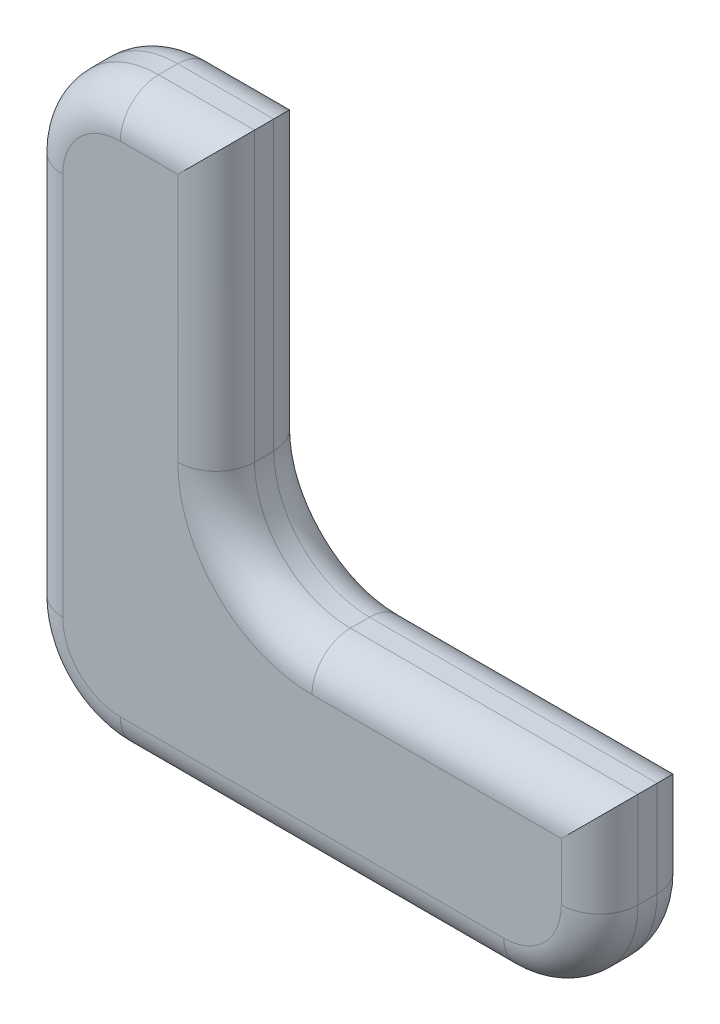
ISO-10303-21;
HEADER;
FILE_DESCRIPTION(('STEP AP214'),'2;1');
FILE_NAME('part.step','',(''),(''),'','','');
FILE_SCHEMA(('AUTOMOTIVE_DESIGN { 1 0 10303 214 1 1 1 1 }'));
ENDSEC;
DATA;
#1=APPLICATION_CONTEXT('core data for automotive mechanical design processes');
#2=APPLICATION_PROTOCOL_DEFINITION('international standard','automotive_design',2000,#1);
#3=PRODUCT_CONTEXT('',#1,'mechanical');
#4=PRODUCT('Part','Part','',(#3));
#5=PRODUCT_RELATED_PRODUCT_CATEGORY('part','',(#4));
#6=PRODUCT_DEFINITION_FORMATION('','',#4);
#7=PRODUCT_DEFINITION_CONTEXT('part definition',#1,'design');
#8=PRODUCT_DEFINITION('design','',#6,#7);
#9=PRODUCT_DEFINITION_SHAPE('','',#8);
#10=(LENGTH_UNIT() NAMED_UNIT(*) SI_UNIT(.MILLI.,.METRE.));
#11=(NAMED_UNIT(*) PLANE_ANGLE_UNIT() SI_UNIT($,.RADIAN.));
#12=(NAMED_UNIT(*) SI_UNIT($,.STERADIAN.) SOLID_ANGLE_UNIT());
#13=UNCERTAINTY_MEASURE_WITH_UNIT(LENGTH_MEASURE(1.E-05),#10,'distance_accuracy_value','');
#14=(GEOMETRIC_REPRESENTATION_CONTEXT(3) GLOBAL_UNCERTAINTY_ASSIGNED_CONTEXT((#13)) GLOBAL_UNIT_ASSIGNED_CONTEXT((#10,
#11,#12)) REPRESENTATION_CONTEXT('',''));
#15=CARTESIAN_POINT('',(0.,0.,0.));
#16=DIRECTION('',(0.,0.,1.));
#17=DIRECTION('',(1.,0.,0.));
#18=AXIS2_PLACEMENT_3D('',#15,#16,#17);
#19=CARTESIAN_POINT('',(10.,0.,5.));
#20=DIRECTION('',(-1.,0.,0.));
#21=DIRECTION('',(0.,-1.,0.));
#22=AXIS2_PLACEMENT_3D('',#19,#20,#21);
#23=PLANE('',#22);
#24=DIRECTION('',(0.,0.,-1.));
#25=VECTOR('',#24,1.);
#26=CARTESIAN_POINT('',(10.,20.,5.));
#27=LINE('',#26,#25);
#28=CARTESIAN_POINT('',(10.,20.,3.));
#29=VERTEX_POINT('',#28);
#30=CARTESIAN_POINT('',(10.,20.,2.));
#31=VERTEX_POINT('',#30);
#32=EDGE_CURVE('E408',#29,#31,#27,.T.);
#33=ORIENTED_EDGE('',*,*,#32,.F.);
#34=DIRECTION('',(0.,1.,0.));
#35=VECTOR('',#34,1.);
#36=CARTESIAN_POINT('',(10.,5.,3.));
#37=LINE('',#36,#35);
#38=CARTESIAN_POINT('',(10.,5.,3.));
#39=VERTEX_POINT('',#38);
#40=EDGE_CURVE('E240',#29,#39,#37,.F.);
#41=ORIENTED_EDGE('',*,*,#40,.T.);
#42=DIRECTION('',(0.,0.,1.));
#43=VECTOR('',#42,1.);
#44=CARTESIAN_POINT('',(10.,5.,0.));
#45=LINE('',#44,#43);
#46=CARTESIAN_POINT('',(10.,5.,2.));
#47=VERTEX_POINT('',#46);
#48=EDGE_CURVE('E201',#39,#47,#45,.F.);
#49=ORIENTED_EDGE('',*,*,#48,.T.);
#50=DIRECTION('',(0.,1.,0.));
#51=VECTOR('',#50,1.);
#52=CARTESIAN_POINT('',(10.,0.,2.));
#53=LINE('',#52,#51);
#54=EDGE_CURVE('E237',#47,#31,#53,.T.);
#55=ORIENTED_EDGE('',*,*,#54,.T.);
#56=EDGE_LOOP('',(#33,#41,#49,#55));
#57=FACE_BOUND('',#56,.T.);
#58=ADVANCED_FACE('F41',(#57),#23,.F.);
#59=CARTESIAN_POINT('',(0.,0.,5.));
#60=DIRECTION('',(1.,0.,0.));
#61=DIRECTION('',(0.,1.,0.));
#62=AXIS2_PLACEMENT_3D('',#59,#60,#61);
#63=PLANE('',#62);
#64=DIRECTION('',(0.,0.,-1.));
#65=VECTOR('',#64,1.);
#66=CARTESIAN_POINT('',(0.,-5.,5.));
#67=LINE('',#66,#65);
#68=CARTESIAN_POINT('',(0.,-5.,2.));
#69=VERTEX_POINT('',#68);
#70=CARTESIAN_POINT('',(0.,-5.,3.));
#71=VERTEX_POINT('',#70);
#72=EDGE_CURVE('E424',#69,#71,#67,.F.);
#73=ORIENTED_EDGE('',*,*,#72,.T.);
#74=DIRECTION('',(0.,-1.,0.));
#75=VECTOR('',#74,1.);
#76=CARTESIAN_POINT('',(0.,15.,3.));
#77=LINE('',#76,#75);
#78=CARTESIAN_POINT('',(0.,15.,3.));
#79=VERTEX_POINT('',#78);
#80=EDGE_CURVE('E222',#71,#79,#77,.F.);
#81=ORIENTED_EDGE('',*,*,#80,.T.);
#82=DIRECTION('',(0.,0.,1.));
#83=VECTOR('',#82,1.);
#84=CARTESIAN_POINT('',(0.,15.,0.));
#85=LINE('',#84,#83);
#86=CARTESIAN_POINT('',(0.,15.,2.));
#87=VERTEX_POINT('',#86);
#88=EDGE_CURVE('E428',#79,#87,#85,.F.);
#89=ORIENTED_EDGE('',*,*,#88,.T.);
#90=DIRECTION('',(0.,-1.,0.));
#91=VECTOR('',#90,1.);
#92=CARTESIAN_POINT('',(0.,0.,2.));
#93=LINE('',#92,#91);
#94=EDGE_CURVE('E219',#87,#69,#93,.T.);
#95=ORIENTED_EDGE('',*,*,#94,.T.);
#96=EDGE_LOOP('',(#73,#81,#89,#95));
#97=FACE_BOUND('',#96,.T.);
#98=ADVANCED_FACE('F472',(#97),#63,.F.);
#99=CARTESIAN_POINT('',(0.,-10.,5.));
#100=DIRECTION('',(0.,1.,0.));
#101=DIRECTION('',(0.,0.,1.));
#102=AXIS2_PLACEMENT_3D('',#99,#100,#101);
#103=PLANE('',#102);
#104=DIRECTION('',(0.,0.,-1.));
#105=VECTOR('',#104,1.);
#106=CARTESIAN_POINT('',(25.,-10.,5.));
#107=LINE('',#106,#105);
#108=CARTESIAN_POINT('',(25.,-10.,2.));
#109=VERTEX_POINT('',#108);
#110=CARTESIAN_POINT('',(25.,-10.,3.));
#111=VERTEX_POINT('',#110);
#112=EDGE_CURVE('E400',#109,#111,#107,.F.);
#113=ORIENTED_EDGE('',*,*,#112,.T.);
#114=DIRECTION('',(1.,0.,0.));
#115=VECTOR('',#114,1.);
#116=CARTESIAN_POINT('',(5.,-10.,3.));
#117=LINE('',#116,#115);
#118=CARTESIAN_POINT('',(5.,-10.,3.));
#119=VERTEX_POINT('',#118);
#120=EDGE_CURVE('E271',#111,#119,#117,.F.);
#121=ORIENTED_EDGE('',*,*,#120,.T.);
#122=DIRECTION('',(0.,0.,-1.));
#123=VECTOR('',#122,1.);
#124=CARTESIAN_POINT('',(5.,-10.,5.));
#125=LINE('',#124,#123);
#126=CARTESIAN_POINT('',(5.,-10.,2.));
#127=VERTEX_POINT('',#126);
#128=EDGE_CURVE('E407',#119,#127,#125,.T.);
#129=ORIENTED_EDGE('',*,*,#128,.T.);
#130=DIRECTION('',(1.,0.,0.));
#131=VECTOR('',#130,1.);
#132=CARTESIAN_POINT('',(0.,-10.,2.));
#133=LINE('',#132,#131);
#134=EDGE_CURVE('E268',#127,#109,#133,.T.);
#135=ORIENTED_EDGE('',*,*,#134,.T.);
#136=EDGE_LOOP('',(#113,#121,#129,#135));
#137=FACE_BOUND('',#136,.T.);
#138=ADVANCED_FACE('F510',(#137),#103,.F.);
#139=CARTESIAN_POINT('',(0.,0.,5.));
#140=DIRECTION('',(0.,0.,1.));
#141=DIRECTION('',(1.,0.,0.));
#142=AXIS2_PLACEMENT_3D('',#139,#140,#141);
#143=PLANE('',#142);
#144=DIRECTION('',(0.,-1.,0.));
#145=VECTOR('',#144,1.);
#146=CARTESIAN_POINT('',(2.,-5.,5.));
#147=LINE('',#146,#145);
#148=CARTESIAN_POINT('',(2.,15.,5.));
#149=VERTEX_POINT('',#148);
#150=CARTESIAN_POINT('',(2.,-5.,5.));
#151=VERTEX_POINT('',#150);
#152=EDGE_CURVE('E205',#149,#151,#147,.T.);
#153=ORIENTED_EDGE('',*,*,#152,.T.);
#154=CARTESIAN_POINT('',(5.,-5.,5.));
#155=DIRECTION('',(0.,0.,1.));
#156=DIRECTION('',(1.,0.,0.));
#157=AXIS2_PLACEMENT_3D('',#154,#155,#156);
#158=CIRCLE('',#157,3.);
#159=CARTESIAN_POINT('',(5.,-8.,5.));
#160=VERTEX_POINT('',#159);
#161=EDGE_CURVE('E184',#151,#160,#158,.T.);
#162=ORIENTED_EDGE('',*,*,#161,.T.);
#163=DIRECTION('',(1.,0.,0.));
#164=VECTOR('',#163,1.);
#165=CARTESIAN_POINT('',(25.,-8.,5.));
#166=LINE('',#165,#164);
#167=CARTESIAN_POINT('',(25.,-8.,5.));
#168=VERTEX_POINT('',#167);
#169=EDGE_CURVE('E193',#160,#168,#166,.T.);
#170=ORIENTED_EDGE('',*,*,#169,.T.);
#171=CARTESIAN_POINT('',(25.,-5.,5.));
#172=DIRECTION('',(0.,0.,1.));
#173=DIRECTION('',(1.,0.,0.));
#174=AXIS2_PLACEMENT_3D('',#171,#172,#173);
#175=CIRCLE('',#174,3.);
#176=CARTESIAN_POINT('',(28.,-5.,5.));
#177=VERTEX_POINT('',#176);
#178=EDGE_CURVE('E200',#168,#177,#175,.T.);
#179=ORIENTED_EDGE('',*,*,#178,.T.);
#180=DIRECTION('',(0.,-1.,0.));
#181=VECTOR('',#180,1.);
#182=CARTESIAN_POINT('',(28.,0.,5.));
#183=LINE('',#182,#181);
#184=CARTESIAN_POINT('',(28.,-2.,5.));
#185=VERTEX_POINT('',#184);
#186=EDGE_CURVE('E441',#177,#185,#183,.F.);
#187=ORIENTED_EDGE('',*,*,#186,.T.);
#188=DIRECTION('',(-1.,0.,0.));
#189=VECTOR('',#188,1.);
#190=CARTESIAN_POINT('',(15.,-2.,5.));
#191=LINE('',#190,#189);
#192=CARTESIAN_POINT('',(15.,-2.,5.));
#193=VERTEX_POINT('',#192);
#194=EDGE_CURVE('E444',#185,#193,#191,.T.);
#195=ORIENTED_EDGE('',*,*,#194,.T.);
#196=CARTESIAN_POINT('',(15.,5.,5.));
#197=DIRECTION('',(0.,0.,1.));
#198=DIRECTION('',(1.,0.,0.));
#199=AXIS2_PLACEMENT_3D('',#196,#197,#198);
#200=CIRCLE('',#199,7.);
#201=CARTESIAN_POINT('',(8.,5.,5.));
#202=VERTEX_POINT('',#201);
#203=EDGE_CURVE('E447',#193,#202,#200,.F.);
#204=ORIENTED_EDGE('',*,*,#203,.T.);
#205=DIRECTION('',(0.,1.,0.));
#206=VECTOR('',#205,1.);
#207=CARTESIAN_POINT('',(8.,20.,5.));
#208=LINE('',#207,#206);
#209=CARTESIAN_POINT('',(8.,18.,5.));
#210=VERTEX_POINT('',#209);
#211=EDGE_CURVE('E450',#202,#210,#208,.T.);
#212=ORIENTED_EDGE('',*,*,#211,.T.);
#213=DIRECTION('',(1.,0.,0.));
#214=VECTOR('',#213,1.);
#215=CARTESIAN_POINT('',(0.,18.,5.));
#216=LINE('',#215,#214);
#217=CARTESIAN_POINT('',(5.,18.,5.));
#218=VERTEX_POINT('',#217);
#219=EDGE_CURVE('E453',#210,#218,#216,.F.);
#220=ORIENTED_EDGE('',*,*,#219,.T.);
#221=CARTESIAN_POINT('',(5.,15.,5.));
#222=DIRECTION('',(0.,0.,1.));
#223=DIRECTION('',(1.,0.,0.));
#224=AXIS2_PLACEMENT_3D('',#221,#222,#223);
#225=CIRCLE('',#224,3.);
#226=EDGE_CURVE('E213',#218,#149,#225,.T.);
#227=ORIENTED_EDGE('',*,*,#226,.T.);
#228=EDGE_LOOP('',(#153,#162,#170,#179,#187,#195,#204,#212,#220,#227));
#229=FACE_BOUND('',#228,.T.);
#230=ADVANCED_FACE('F203',(#229),#143,.T.);
#231=CARTESIAN_POINT('',(0.,0.,0.));
#232=DIRECTION('',(0.,0.,1.));
#233=DIRECTION('',(1.,0.,0.));
#234=AXIS2_PLACEMENT_3D('',#231,#232,#233);
#235=PLANE('',#234);
#236=CARTESIAN_POINT('',(15.,5.,0.));
#237=DIRECTION('',(0.,0.,1.));
#238=DIRECTION('',(1.,0.,0.));
#239=AXIS2_PLACEMENT_3D('',#236,#237,#238);
#240=CIRCLE('',#239,7.);
#241=CARTESIAN_POINT('',(8.,5.,0.));
#242=VERTEX_POINT('',#241);
#243=CARTESIAN_POINT('',(15.,-2.,0.));
#244=VERTEX_POINT('',#243);
#245=EDGE_CURVE('E51',#242,#244,#240,.T.);
#246=ORIENTED_EDGE('',*,*,#245,.T.);
#247=DIRECTION('',(-1.,0.,0.));
#248=VECTOR('',#247,1.);
#249=CARTESIAN_POINT('',(0.,-2.,0.));
#250=LINE('',#249,#248);
#251=CARTESIAN_POINT('',(28.,-2.,0.));
#252=VERTEX_POINT('',#251);
#253=EDGE_CURVE('E11',#244,#252,#250,.F.);
#254=ORIENTED_EDGE('',*,*,#253,.T.);
#255=DIRECTION('',(0.,1.,0.));
#256=VECTOR('',#255,1.);
#257=CARTESIAN_POINT('',(28.,0.,0.));
#258=LINE('',#257,#256);
#259=CARTESIAN_POINT('',(28.,-5.,0.));
#260=VERTEX_POINT('',#259);
#261=EDGE_CURVE('E274',#252,#260,#258,.F.);
#262=ORIENTED_EDGE('',*,*,#261,.T.);
#263=CARTESIAN_POINT('',(25.,-5.,0.));
#264=DIRECTION('',(0.,0.,1.));
#265=DIRECTION('',(1.,0.,0.));
#266=AXIS2_PLACEMENT_3D('',#263,#264,#265);
#267=CIRCLE('',#266,3.);
#268=CARTESIAN_POINT('',(25.,-8.,0.));
#269=VERTEX_POINT('',#268);
#270=EDGE_CURVE('E277',#260,#269,#267,.F.);
#271=ORIENTED_EDGE('',*,*,#270,.T.);
#272=DIRECTION('',(1.,0.,0.));
#273=VECTOR('',#272,1.);
#274=CARTESIAN_POINT('',(0.,-8.,0.));
#275=LINE('',#274,#273);
#276=CARTESIAN_POINT('',(5.,-8.,0.));
#277=VERTEX_POINT('',#276);
#278=EDGE_CURVE('E280',#269,#277,#275,.F.);
#279=ORIENTED_EDGE('',*,*,#278,.T.);
#280=CARTESIAN_POINT('',(5.,-5.,0.));
#281=DIRECTION('',(0.,0.,1.));
#282=DIRECTION('',(1.,0.,0.));
#283=AXIS2_PLACEMENT_3D('',#280,#281,#282);
#284=CIRCLE('',#283,3.);
#285=CARTESIAN_POINT('',(2.,-5.,0.));
#286=VERTEX_POINT('',#285);
#287=EDGE_CURVE('E283',#277,#286,#284,.F.);
#288=ORIENTED_EDGE('',*,*,#287,.T.);
#289=DIRECTION('',(0.,-1.,0.));
#290=VECTOR('',#289,1.);
#291=CARTESIAN_POINT('',(2.,0.,0.));
#292=LINE('',#291,#290);
#293=CARTESIAN_POINT('',(2.,15.,0.));
#294=VERTEX_POINT('',#293);
#295=EDGE_CURVE('E286',#286,#294,#292,.F.);
#296=ORIENTED_EDGE('',*,*,#295,.T.);
#297=CARTESIAN_POINT('',(5.,15.,0.));
#298=DIRECTION('',(0.,0.,1.));
#299=DIRECTION('',(1.,0.,0.));
#300=AXIS2_PLACEMENT_3D('',#297,#298,#299);
#301=CIRCLE('',#300,3.);
#302=CARTESIAN_POINT('',(5.,18.,0.));
#303=VERTEX_POINT('',#302);
#304=EDGE_CURVE('E289',#294,#303,#301,.F.);
#305=ORIENTED_EDGE('',*,*,#304,.T.);
#306=DIRECTION('',(-1.,0.,0.));
#307=VECTOR('',#306,1.);
#308=CARTESIAN_POINT('',(10.,18.,0.));
#309=LINE('',#308,#307);
#310=CARTESIAN_POINT('',(8.,18.,0.));
#311=VERTEX_POINT('',#310);
#312=EDGE_CURVE('E292',#303,#311,#309,.F.);
#313=ORIENTED_EDGE('',*,*,#312,.T.);
#314=DIRECTION('',(0.,1.,0.));
#315=VECTOR('',#314,1.);
#316=CARTESIAN_POINT('',(8.,0.,0.));
#317=LINE('',#316,#315);
#318=EDGE_CURVE('E62',#311,#242,#317,.F.);
#319=ORIENTED_EDGE('',*,*,#318,.T.);
#320=EDGE_LOOP('',(#246,#254,#262,#271,#279,#288,#296,#305,#313,#319));
#321=FACE_BOUND('',#320,.T.);
#322=ADVANCED_FACE('F379',(#321),#235,.F.);
#323=CARTESIAN_POINT('',(0.,20.,0.));
#324=DIRECTION('',(0.,1.,0.));
#325=DIRECTION('',(0.,0.,1.));
#326=AXIS2_PLACEMENT_3D('',#323,#324,#325);
#327=PLANE('',#326);
#328=DIRECTION('',(0.,0.,1.));
#329=VECTOR('',#328,1.);
#330=CARTESIAN_POINT('',(5.,20.,5.));
#331=LINE('',#330,#329);
#332=CARTESIAN_POINT('',(5.,20.,2.));
#333=VERTEX_POINT('',#332);
#334=CARTESIAN_POINT('',(5.,20.,3.));
#335=VERTEX_POINT('',#334);
#336=EDGE_CURVE('E420',#333,#335,#331,.T.);
#337=ORIENTED_EDGE('',*,*,#336,.T.);
#338=DIRECTION('',(1.,0.,0.));
#339=VECTOR('',#338,1.);
#340=CARTESIAN_POINT('',(0.,20.,3.));
#341=LINE('',#340,#339);
#342=EDGE_CURVE('E234',#335,#29,#341,.T.);
#343=ORIENTED_EDGE('',*,*,#342,.T.);
#344=ORIENTED_EDGE('',*,*,#32,.T.);
#345=DIRECTION('',(-1.,0.,0.));
#346=VECTOR('',#345,1.);
#347=CARTESIAN_POINT('',(5.,20.,2.));
#348=LINE('',#347,#346);
#349=EDGE_CURVE('E231',#31,#333,#348,.T.);
#350=ORIENTED_EDGE('',*,*,#349,.T.);
#351=EDGE_LOOP('',(#337,#343,#344,#350));
#352=FACE_BOUND('',#351,.T.);
#353=ADVANCED_FACE('F734',(#352),#327,.T.);
#354=CARTESIAN_POINT('',(30.,0.,5.));
#355=DIRECTION('',(0.,-1.,0.));
#356=DIRECTION('',(1.,0.,0.));
#357=AXIS2_PLACEMENT_3D('',#354,#355,#356);
#358=PLANE('',#357);
#359=DIRECTION('',(0.,0.,1.));
#360=VECTOR('',#359,1.);
#361=CARTESIAN_POINT('',(15.,0.,5.));
#362=LINE('',#361,#360);
#363=CARTESIAN_POINT('',(15.,0.,2.));
#364=VERTEX_POINT('',#363);
#365=CARTESIAN_POINT('',(15.,0.,3.));
#366=VERTEX_POINT('',#365);
#367=EDGE_CURVE('E432',#364,#366,#362,.T.);
#368=ORIENTED_EDGE('',*,*,#367,.T.);
#369=DIRECTION('',(-1.,0.,0.));
#370=VECTOR('',#369,1.);
#371=CARTESIAN_POINT('',(30.,0.,3.));
#372=LINE('',#371,#370);
#373=CARTESIAN_POINT('',(30.,0.,3.));
#374=VERTEX_POINT('',#373);
#375=EDGE_CURVE('E253',#366,#374,#372,.F.);
#376=ORIENTED_EDGE('',*,*,#375,.T.);
#377=DIRECTION('',(0.,0.,1.));
#378=VECTOR('',#377,1.);
#379=CARTESIAN_POINT('',(30.,0.,5.));
#380=LINE('',#379,#378);
#381=CARTESIAN_POINT('',(30.,0.,2.));
#382=VERTEX_POINT('',#381);
#383=EDGE_CURVE('E331',#382,#374,#380,.T.);
#384=ORIENTED_EDGE('',*,*,#383,.F.);
#385=DIRECTION('',(-1.,0.,0.));
#386=VECTOR('',#385,1.);
#387=CARTESIAN_POINT('',(30.,0.,2.));
#388=LINE('',#387,#386);
#389=EDGE_CURVE('E249',#382,#364,#388,.T.);
#390=ORIENTED_EDGE('',*,*,#389,.T.);
#391=EDGE_LOOP('',(#368,#376,#384,#390));
#392=FACE_BOUND('',#391,.T.);
#393=ADVANCED_FACE('F725',(#392),#358,.F.);
#394=CARTESIAN_POINT('',(30.,0.,0.));
#395=DIRECTION('',(-1.,0.,0.));
#396=DIRECTION('',(0.,-1.,0.));
#397=AXIS2_PLACEMENT_3D('',#394,#395,#396);
#398=PLANE('',#397);
#399=ORIENTED_EDGE('',*,*,#383,.T.);
#400=DIRECTION('',(0.,-1.,0.));
#401=VECTOR('',#400,1.);
#402=CARTESIAN_POINT('',(30.,-5.,3.));
#403=LINE('',#402,#401);
#404=CARTESIAN_POINT('',(30.,-5.,3.));
#405=VERTEX_POINT('',#404);
#406=EDGE_CURVE('E259',#374,#405,#403,.T.);
#407=ORIENTED_EDGE('',*,*,#406,.T.);
#408=DIRECTION('',(0.,0.,-1.));
#409=VECTOR('',#408,1.);
#410=CARTESIAN_POINT('',(30.,-5.,0.));
#411=LINE('',#410,#409);
#412=CARTESIAN_POINT('',(30.,-5.,2.));
#413=VERTEX_POINT('',#412);
#414=EDGE_CURVE('E397',#405,#413,#411,.T.);
#415=ORIENTED_EDGE('',*,*,#414,.T.);
#416=DIRECTION('',(0.,1.,0.));
#417=VECTOR('',#416,1.);
#418=CARTESIAN_POINT('',(30.,0.,2.));
#419=LINE('',#418,#417);
#420=EDGE_CURVE('E256',#413,#382,#419,.T.);
#421=ORIENTED_EDGE('',*,*,#420,.T.);
#422=EDGE_LOOP('',(#399,#407,#415,#421));
#423=FACE_BOUND('',#422,.T.);
#424=ADVANCED_FACE('F403',(#423),#398,.F.);
#425=CARTESIAN_POINT('',(25.,-5.,0.));
#426=DIRECTION('',(0.,0.,-1.));
#427=DIRECTION('',(-1.,0.,0.));
#428=AXIS2_PLACEMENT_3D('',#425,#426,#427);
#429=CYLINDRICAL_SURFACE('',#428,5.);
#430=ORIENTED_EDGE('',*,*,#414,.F.);
#431=CARTESIAN_POINT('',(25.,-5.,3.));
#432=DIRECTION('',(0.,0.,1.));
#433=DIRECTION('',(1.,0.,0.));
#434=AXIS2_PLACEMENT_3D('',#431,#432,#433);
#435=CIRCLE('',#434,5.);
#436=EDGE_CURVE('E265',#405,#111,#435,.F.);
#437=ORIENTED_EDGE('',*,*,#436,.T.);
#438=ORIENTED_EDGE('',*,*,#112,.F.);
#439=CARTESIAN_POINT('',(25.,-5.,2.));
#440=DIRECTION('',(0.,0.,1.));
#441=DIRECTION('',(1.,0.,0.));
#442=AXIS2_PLACEMENT_3D('',#439,#440,#441);
#443=CIRCLE('',#442,5.);
#444=EDGE_CURVE('E262',#109,#413,#443,.T.);
#445=ORIENTED_EDGE('',*,*,#444,.T.);
#446=EDGE_LOOP('',(#430,#437,#438,#445));
#447=FACE_BOUND('',#446,.T.);
#448=ADVANCED_FACE('F396',(#447),#429,.T.);
#449=CARTESIAN_POINT('',(5.,15.,0.));
#450=DIRECTION('',(0.,0.,-1.));
#451=DIRECTION('',(-1.,0.,0.));
#452=AXIS2_PLACEMENT_3D('',#449,#450,#451);
#453=CYLINDRICAL_SURFACE('',#452,5.);
#454=ORIENTED_EDGE('',*,*,#88,.F.);
#455=CARTESIAN_POINT('',(5.,15.,3.));
#456=DIRECTION('',(0.,0.,1.));
#457=DIRECTION('',(1.,0.,0.));
#458=AXIS2_PLACEMENT_3D('',#455,#456,#457);
#459=CIRCLE('',#458,5.);
#460=EDGE_CURVE('E228',#79,#335,#459,.F.);
#461=ORIENTED_EDGE('',*,*,#460,.T.);
#462=ORIENTED_EDGE('',*,*,#336,.F.);
#463=CARTESIAN_POINT('',(5.,15.,2.));
#464=DIRECTION('',(0.,0.,1.));
#465=DIRECTION('',(1.,0.,0.));
#466=AXIS2_PLACEMENT_3D('',#463,#464,#465);
#467=CIRCLE('',#466,5.);
#468=EDGE_CURVE('E225',#333,#87,#467,.T.);
#469=ORIENTED_EDGE('',*,*,#468,.T.);
#470=EDGE_LOOP('',(#454,#461,#462,#469));
#471=FACE_BOUND('',#470,.T.);
#472=ADVANCED_FACE('F474',(#471),#453,.T.);
#473=CARTESIAN_POINT('',(15.,5.,5.));
#474=DIRECTION('',(0.,0.,-1.));
#475=DIRECTION('',(-1.,0.,0.));
#476=AXIS2_PLACEMENT_3D('',#473,#474,#475);
#477=CYLINDRICAL_SURFACE('',#476,5.);
#478=ORIENTED_EDGE('',*,*,#48,.F.);
#479=CARTESIAN_POINT('',(15.,5.,3.));
#480=DIRECTION('',(0.,0.,1.));
#481=DIRECTION('',(1.,0.,0.));
#482=AXIS2_PLACEMENT_3D('',#479,#480,#481);
#483=CIRCLE('',#482,5.);
#484=EDGE_CURVE('E246',#39,#366,#483,.T.);
#485=ORIENTED_EDGE('',*,*,#484,.T.);
#486=ORIENTED_EDGE('',*,*,#367,.F.);
#487=CARTESIAN_POINT('',(15.,5.,2.));
#488=DIRECTION('',(0.,0.,1.));
#489=DIRECTION('',(1.,0.,0.));
#490=AXIS2_PLACEMENT_3D('',#487,#488,#489);
#491=CIRCLE('',#490,5.);
#492=EDGE_CURVE('E243',#364,#47,#491,.F.);
#493=ORIENTED_EDGE('',*,*,#492,.T.);
#494=EDGE_LOOP('',(#478,#485,#486,#493));
#495=FACE_BOUND('',#494,.T.);
#496=ADVANCED_FACE('F523',(#495),#477,.F.);
#497=CARTESIAN_POINT('',(5.,-5.,5.));
#498=DIRECTION('',(0.,0.,-1.));
#499=DIRECTION('',(-1.,0.,0.));
#500=AXIS2_PLACEMENT_3D('',#497,#498,#499);
#501=CYLINDRICAL_SURFACE('',#500,5.);
#502=ORIENTED_EDGE('',*,*,#128,.F.);
#503=CARTESIAN_POINT('',(5.,-5.,3.));
#504=DIRECTION('',(0.,0.,1.));
#505=DIRECTION('',(1.,0.,0.));
#506=AXIS2_PLACEMENT_3D('',#503,#504,#505);
#507=CIRCLE('',#506,5.);
#508=EDGE_CURVE('E186',#119,#71,#507,.F.);
#509=ORIENTED_EDGE('',*,*,#508,.T.);
#510=ORIENTED_EDGE('',*,*,#72,.F.);
#511=CARTESIAN_POINT('',(5.,-5.,2.));
#512=DIRECTION('',(0.,0.,1.));
#513=DIRECTION('',(1.,0.,0.));
#514=AXIS2_PLACEMENT_3D('',#511,#512,#513);
#515=CIRCLE('',#514,5.);
#516=EDGE_CURVE('E208',#69,#127,#515,.T.);
#517=ORIENTED_EDGE('',*,*,#516,.T.);
#518=EDGE_LOOP('',(#502,#509,#510,#517));
#519=FACE_BOUND('',#518,.T.);
#520=ADVANCED_FACE('F471',(#519),#501,.T.);
#521=CARTESIAN_POINT('',(15.,5.,3.));
#522=DIRECTION('',(0.,0.,1.));
#523=DIRECTION('',(1.,0.,0.));
#524=AXIS2_PLACEMENT_3D('',#521,#522,#523);
#525=TOROIDAL_SURFACE('',#524,7.,2.);
#526=CARTESIAN_POINT('',(15.,-2.,3.));
#527=DIRECTION('',(1.,0.,0.));
#528=DIRECTION('',(0.,0.,-1.));
#529=AXIS2_PLACEMENT_3D('',#526,#527,#528);
#530=CIRCLE('',#529,2.);
#531=EDGE_CURVE('E323',#366,#193,#530,.T.);
#532=ORIENTED_EDGE('',*,*,#531,.F.);
#533=ORIENTED_EDGE('',*,*,#484,.F.);
#534=CARTESIAN_POINT('',(8.,5.,3.));
#535=DIRECTION('',(0.,1.,0.));
#536=DIRECTION('',(0.,0.,1.));
#537=AXIS2_PLACEMENT_3D('',#534,#535,#536);
#538=CIRCLE('',#537,2.);
#539=EDGE_CURVE('E327',#202,#39,#538,.T.);
#540=ORIENTED_EDGE('',*,*,#539,.F.);
#541=ORIENTED_EDGE('',*,*,#203,.F.);
#542=EDGE_LOOP('',(#532,#533,#540,#541));
#543=FACE_BOUND('',#542,.T.);
#544=ADVANCED_FACE('F529',(#543),#525,.T.);
#545=CARTESIAN_POINT('',(8.,0.,3.));
#546=DIRECTION('',(0.,-1.,0.));
#547=DIRECTION('',(1.,0.,0.));
#548=AXIS2_PLACEMENT_3D('',#545,#546,#547);
#549=CYLINDRICAL_SURFACE('',#548,2.);
#550=ORIENTED_EDGE('',*,*,#539,.T.);
#551=ORIENTED_EDGE('',*,*,#40,.F.);
#552=CARTESIAN_POINT('',(8.,18.,3.));
#553=DIRECTION('',(0.707106781186548,-0.707106781186547,0.));
#554=DIRECTION('',(-0.707106781186547,-0.707106781186548,0.));
#555=AXIS2_PLACEMENT_3D('',#552,#553,#554);
#556=ELLIPSE('',#555,2.82842712474619,2.);
#557=EDGE_CURVE('E319',#210,#29,#556,.F.);
#558=ORIENTED_EDGE('',*,*,#557,.F.);
#559=ORIENTED_EDGE('',*,*,#211,.F.);
#560=EDGE_LOOP('',(#550,#551,#558,#559));
#561=FACE_BOUND('',#560,.T.);
#562=ADVANCED_FACE('F553',(#561),#549,.T.);
#563=CARTESIAN_POINT('',(0.,-2.,3.));
#564=DIRECTION('',(1.,0.,0.));
#565=DIRECTION('',(0.,1.,0.));
#566=AXIS2_PLACEMENT_3D('',#563,#564,#565);
#567=CYLINDRICAL_SURFACE('',#566,2.);
#568=ORIENTED_EDGE('',*,*,#531,.T.);
#569=ORIENTED_EDGE('',*,*,#194,.F.);
#570=CARTESIAN_POINT('',(28.,-2.,3.));
#571=DIRECTION('',(-0.707106781186548,0.707106781186547,0.));
#572=DIRECTION('',(0.707106781186547,0.707106781186548,0.));
#573=AXIS2_PLACEMENT_3D('',#570,#571,#572);
#574=ELLIPSE('',#573,2.82842712474619,2.);
#575=EDGE_CURVE('E315',#374,#185,#574,.F.);
#576=ORIENTED_EDGE('',*,*,#575,.F.);
#577=ORIENTED_EDGE('',*,*,#375,.F.);
#578=EDGE_LOOP('',(#568,#569,#576,#577));
#579=FACE_BOUND('',#578,.T.);
#580=ADVANCED_FACE('F549',(#579),#567,.T.);
#581=CARTESIAN_POINT('',(0.,18.,3.));
#582=DIRECTION('',(1.,0.,0.));
#583=DIRECTION('',(0.,0.,-1.));
#584=AXIS2_PLACEMENT_3D('',#581,#582,#583);
#585=CYLINDRICAL_SURFACE('',#584,2.);
#586=ORIENTED_EDGE('',*,*,#557,.T.);
#587=ORIENTED_EDGE('',*,*,#342,.F.);
#588=CARTESIAN_POINT('',(5.,18.,3.));
#589=DIRECTION('',(-1.,0.,0.));
#590=DIRECTION('',(0.,0.,1.));
#591=AXIS2_PLACEMENT_3D('',#588,#589,#590);
#592=CIRCLE('',#591,2.);
#593=EDGE_CURVE('E311',#218,#335,#592,.T.);
#594=ORIENTED_EDGE('',*,*,#593,.F.);
#595=ORIENTED_EDGE('',*,*,#219,.F.);
#596=EDGE_LOOP('',(#586,#587,#594,#595));
#597=FACE_BOUND('',#596,.T.);
#598=ADVANCED_FACE('F545',(#597),#585,.T.);
#599=CARTESIAN_POINT('',(28.,0.,3.));
#600=DIRECTION('',(0.,1.,0.));
#601=DIRECTION('',(-1.,0.,0.));
#602=AXIS2_PLACEMENT_3D('',#599,#600,#601);
#603=CYLINDRICAL_SURFACE('',#602,2.);
#604=ORIENTED_EDGE('',*,*,#575,.T.);
#605=ORIENTED_EDGE('',*,*,#186,.F.);
#606=CARTESIAN_POINT('',(28.,-5.,3.));
#607=DIRECTION('',(0.,-1.,0.));
#608=DIRECTION('',(0.,0.,-1.));
#609=AXIS2_PLACEMENT_3D('',#606,#607,#608);
#610=CIRCLE('',#609,2.);
#611=EDGE_CURVE('E307',#405,#177,#610,.T.);
#612=ORIENTED_EDGE('',*,*,#611,.F.);
#613=ORIENTED_EDGE('',*,*,#406,.F.);
#614=EDGE_LOOP('',(#604,#605,#612,#613));
#615=FACE_BOUND('',#614,.T.);
#616=ADVANCED_FACE('F542',(#615),#603,.T.);
#617=CARTESIAN_POINT('',(5.,15.,3.));
#618=DIRECTION('',(0.,0.,1.));
#619=DIRECTION('',(1.,0.,0.));
#620=AXIS2_PLACEMENT_3D('',#617,#618,#619);
#621=TOROIDAL_SURFACE('',#620,3.,2.);
#622=ORIENTED_EDGE('',*,*,#593,.T.);
#623=ORIENTED_EDGE('',*,*,#460,.F.);
#624=CARTESIAN_POINT('',(2.,15.,3.));
#625=DIRECTION('',(0.,-1.,0.));
#626=DIRECTION('',(0.,0.,-1.));
#627=AXIS2_PLACEMENT_3D('',#624,#625,#626);
#628=CIRCLE('',#627,2.);
#629=EDGE_CURVE('E303',#149,#79,#628,.T.);
#630=ORIENTED_EDGE('',*,*,#629,.F.);
#631=ORIENTED_EDGE('',*,*,#226,.F.);
#632=EDGE_LOOP('',(#622,#623,#630,#631));
#633=FACE_BOUND('',#632,.T.);
#634=ADVANCED_FACE('F462',(#633),#621,.T.);
#635=CARTESIAN_POINT('',(25.,-5.,3.));
#636=DIRECTION('',(0.,0.,1.));
#637=DIRECTION('',(1.,0.,0.));
#638=AXIS2_PLACEMENT_3D('',#635,#636,#637);
#639=TOROIDAL_SURFACE('',#638,3.,2.);
#640=ORIENTED_EDGE('',*,*,#611,.T.);
#641=ORIENTED_EDGE('',*,*,#178,.F.);
#642=CARTESIAN_POINT('',(25.,-8.,3.));
#643=DIRECTION('',(-1.,0.,0.));
#644=DIRECTION('',(0.,0.,1.));
#645=AXIS2_PLACEMENT_3D('',#642,#643,#644);
#646=CIRCLE('',#645,2.);
#647=EDGE_CURVE('E196',#111,#168,#646,.T.);
#648=ORIENTED_EDGE('',*,*,#647,.F.);
#649=ORIENTED_EDGE('',*,*,#436,.F.);
#650=EDGE_LOOP('',(#640,#641,#648,#649));
#651=FACE_BOUND('',#650,.T.);
#652=ADVANCED_FACE('F536',(#651),#639,.T.);
#653=CARTESIAN_POINT('',(2.,0.,3.));
#654=DIRECTION('',(0.,1.,0.));
#655=DIRECTION('',(-1.,0.,0.));
#656=AXIS2_PLACEMENT_3D('',#653,#654,#655);
#657=CYLINDRICAL_SURFACE('',#656,2.);
#658=ORIENTED_EDGE('',*,*,#629,.T.);
#659=ORIENTED_EDGE('',*,*,#80,.F.);
#660=CARTESIAN_POINT('',(2.,-5.,3.));
#661=DIRECTION('',(0.,-1.,0.));
#662=DIRECTION('',(0.,0.,-1.));
#663=AXIS2_PLACEMENT_3D('',#660,#661,#662);
#664=CIRCLE('',#663,2.);
#665=EDGE_CURVE('E190',#151,#71,#664,.T.);
#666=ORIENTED_EDGE('',*,*,#665,.F.);
#667=ORIENTED_EDGE('',*,*,#152,.F.);
#668=EDGE_LOOP('',(#658,#659,#666,#667));
#669=FACE_BOUND('',#668,.T.);
#670=ADVANCED_FACE('F465',(#669),#657,.T.);
#671=CARTESIAN_POINT('',(0.,-8.,3.));
#672=DIRECTION('',(-1.,0.,0.));
#673=DIRECTION('',(0.,0.,1.));
#674=AXIS2_PLACEMENT_3D('',#671,#672,#673);
#675=CYLINDRICAL_SURFACE('',#674,2.);
#676=ORIENTED_EDGE('',*,*,#647,.T.);
#677=ORIENTED_EDGE('',*,*,#169,.F.);
#678=CARTESIAN_POINT('',(5.,-8.,3.));
#679=DIRECTION('',(-1.,0.,0.));
#680=DIRECTION('',(0.,0.,1.));
#681=AXIS2_PLACEMENT_3D('',#678,#679,#680);
#682=CIRCLE('',#681,2.);
#683=EDGE_CURVE('E180',#119,#160,#682,.T.);
#684=ORIENTED_EDGE('',*,*,#683,.F.);
#685=ORIENTED_EDGE('',*,*,#120,.F.);
#686=EDGE_LOOP('',(#676,#677,#684,#685));
#687=FACE_BOUND('',#686,.T.);
#688=ADVANCED_FACE('F194',(#687),#675,.T.);
#689=CARTESIAN_POINT('',(5.,-5.,3.));
#690=DIRECTION('',(0.,0.,1.));
#691=DIRECTION('',(1.,0.,0.));
#692=AXIS2_PLACEMENT_3D('',#689,#690,#691);
#693=TOROIDAL_SURFACE('',#692,3.,2.);
#694=ORIENTED_EDGE('',*,*,#665,.T.);
#695=ORIENTED_EDGE('',*,*,#508,.F.);
#696=ORIENTED_EDGE('',*,*,#683,.T.);
#697=ORIENTED_EDGE('',*,*,#161,.F.);
#698=EDGE_LOOP('',(#694,#695,#696,#697));
#699=FACE_BOUND('',#698,.T.);
#700=ADVANCED_FACE('F182',(#699),#693,.T.);
#701=CARTESIAN_POINT('',(2.,0.,2.));
#702=DIRECTION('',(0.,-1.,0.));
#703=DIRECTION('',(1.,0.,0.));
#704=AXIS2_PLACEMENT_3D('',#701,#702,#703);
#705=CYLINDRICAL_SURFACE('',#704,2.);
#706=CARTESIAN_POINT('',(2.,15.,2.));
#707=DIRECTION('',(0.,1.,0.));
#708=DIRECTION('',(0.,0.,1.));
#709=AXIS2_PLACEMENT_3D('',#706,#707,#708);
#710=CIRCLE('',#709,2.);
#711=EDGE_CURVE('E361',#294,#87,#710,.T.);
#712=ORIENTED_EDGE('',*,*,#711,.F.);
#713=ORIENTED_EDGE('',*,*,#295,.F.);
#714=CARTESIAN_POINT('',(2.,-5.,2.));
#715=DIRECTION('',(0.,-1.,0.));
#716=DIRECTION('',(0.,0.,-1.));
#717=AXIS2_PLACEMENT_3D('',#714,#715,#716);
#718=CIRCLE('',#717,2.);
#719=EDGE_CURVE('E45',#69,#286,#718,.T.);
#720=ORIENTED_EDGE('',*,*,#719,.F.);
#721=ORIENTED_EDGE('',*,*,#94,.F.);
#722=EDGE_LOOP('',(#712,#713,#720,#721));
#723=FACE_BOUND('',#722,.T.);
#724=ADVANCED_FACE('F43',(#723),#705,.T.);
#725=CARTESIAN_POINT('',(5.,-5.,2.));
#726=DIRECTION('',(0.,0.,1.));
#727=DIRECTION('',(1.,0.,0.));
#728=AXIS2_PLACEMENT_3D('',#725,#726,#727);
#729=TOROIDAL_SURFACE('',#728,3.,2.);
#730=ORIENTED_EDGE('',*,*,#719,.T.);
#731=ORIENTED_EDGE('',*,*,#287,.F.);
#732=CARTESIAN_POINT('',(5.,-8.,2.));
#733=DIRECTION('',(1.,0.,0.));
#734=DIRECTION('',(0.,0.,-1.));
#735=AXIS2_PLACEMENT_3D('',#732,#733,#734);
#736=CIRCLE('',#735,2.);
#737=EDGE_CURVE('E358',#127,#277,#736,.T.);
#738=ORIENTED_EDGE('',*,*,#737,.F.);
#739=ORIENTED_EDGE('',*,*,#516,.F.);
#740=EDGE_LOOP('',(#730,#731,#738,#739));
#741=FACE_BOUND('',#740,.T.);
#742=ADVANCED_FACE('F374',(#741),#729,.T.);
#743=CARTESIAN_POINT('',(5.,15.,2.));
#744=DIRECTION('',(0.,0.,1.));
#745=DIRECTION('',(1.,0.,0.));
#746=AXIS2_PLACEMENT_3D('',#743,#744,#745);
#747=TOROIDAL_SURFACE('',#746,3.,2.);
#748=ORIENTED_EDGE('',*,*,#711,.T.);
#749=ORIENTED_EDGE('',*,*,#468,.F.);
#750=CARTESIAN_POINT('',(5.,18.,2.));
#751=DIRECTION('',(1.,0.,0.));
#752=DIRECTION('',(0.,0.,-1.));
#753=AXIS2_PLACEMENT_3D('',#750,#751,#752);
#754=CIRCLE('',#753,2.);
#755=EDGE_CURVE('E354',#303,#333,#754,.T.);
#756=ORIENTED_EDGE('',*,*,#755,.F.);
#757=ORIENTED_EDGE('',*,*,#304,.F.);
#758=EDGE_LOOP('',(#748,#749,#756,#757));
#759=FACE_BOUND('',#758,.T.);
#760=ADVANCED_FACE('F476',(#759),#747,.T.);
#761=CARTESIAN_POINT('',(0.,-8.,2.));
#762=DIRECTION('',(1.,0.,0.));
#763=DIRECTION('',(0.,0.,-1.));
#764=AXIS2_PLACEMENT_3D('',#761,#762,#763);
#765=CYLINDRICAL_SURFACE('',#764,2.);
#766=ORIENTED_EDGE('',*,*,#737,.T.);
#767=ORIENTED_EDGE('',*,*,#278,.F.);
#768=CARTESIAN_POINT('',(25.,-8.,2.));
#769=DIRECTION('',(1.,0.,0.));
#770=DIRECTION('',(0.,0.,-1.));
#771=AXIS2_PLACEMENT_3D('',#768,#769,#770);
#772=CIRCLE('',#771,2.);
#773=EDGE_CURVE('E350',#109,#269,#772,.T.);
#774=ORIENTED_EDGE('',*,*,#773,.F.);
#775=ORIENTED_EDGE('',*,*,#134,.F.);
#776=EDGE_LOOP('',(#766,#767,#774,#775));
#777=FACE_BOUND('',#776,.T.);
#778=ADVANCED_FACE('F385',(#777),#765,.T.);
#779=CARTESIAN_POINT('',(0.,18.,2.));
#780=DIRECTION('',(1.,0.,0.));
#781=DIRECTION('',(0.,0.,-1.));
#782=AXIS2_PLACEMENT_3D('',#779,#780,#781);
#783=CYLINDRICAL_SURFACE('',#782,2.);
#784=ORIENTED_EDGE('',*,*,#755,.T.);
#785=ORIENTED_EDGE('',*,*,#349,.F.);
#786=CARTESIAN_POINT('',(8.,18.,2.));
#787=DIRECTION('',(0.707106781186548,-0.707106781186547,0.));
#788=DIRECTION('',(0.707106781186547,0.707106781186548,0.));
#789=AXIS2_PLACEMENT_3D('',#786,#787,#788);
#790=ELLIPSE('',#789,2.82842712474619,2.);
#791=EDGE_CURVE('E346',#311,#31,#790,.T.);
#792=ORIENTED_EDGE('',*,*,#791,.F.);
#793=ORIENTED_EDGE('',*,*,#312,.F.);
#794=EDGE_LOOP('',(#784,#785,#792,#793));
#795=FACE_BOUND('',#794,.T.);
#796=ADVANCED_FACE('F480',(#795),#783,.T.);
#797=CARTESIAN_POINT('',(25.,-5.,2.));
#798=DIRECTION('',(0.,0.,1.));
#799=DIRECTION('',(1.,0.,0.));
#800=AXIS2_PLACEMENT_3D('',#797,#798,#799);
#801=TOROIDAL_SURFACE('',#800,3.,2.);
#802=ORIENTED_EDGE('',*,*,#773,.T.);
#803=ORIENTED_EDGE('',*,*,#270,.F.);
#804=CARTESIAN_POINT('',(28.,-5.,2.));
#805=DIRECTION('',(0.,1.,0.));
#806=DIRECTION('',(0.,0.,1.));
#807=AXIS2_PLACEMENT_3D('',#804,#805,#806);
#808=CIRCLE('',#807,2.);
#809=EDGE_CURVE('E342',#413,#260,#808,.T.);
#810=ORIENTED_EDGE('',*,*,#809,.F.);
#811=ORIENTED_EDGE('',*,*,#444,.F.);
#812=EDGE_LOOP('',(#802,#803,#810,#811));
#813=FACE_BOUND('',#812,.T.);
#814=ADVANCED_FACE('F389',(#813),#801,.T.);
#815=CARTESIAN_POINT('',(8.,0.,2.));
#816=DIRECTION('',(0.,1.,0.));
#817=DIRECTION('',(-1.,0.,0.));
#818=AXIS2_PLACEMENT_3D('',#815,#816,#817);
#819=CYLINDRICAL_SURFACE('',#818,2.);
#820=ORIENTED_EDGE('',*,*,#791,.T.);
#821=ORIENTED_EDGE('',*,*,#54,.F.);
#822=CARTESIAN_POINT('',(8.,5.,2.));
#823=DIRECTION('',(0.,-1.,0.));
#824=DIRECTION('',(0.,0.,-1.));
#825=AXIS2_PLACEMENT_3D('',#822,#823,#824);
#826=CIRCLE('',#825,2.);
#827=EDGE_CURVE('E338',#242,#47,#826,.T.);
#828=ORIENTED_EDGE('',*,*,#827,.F.);
#829=ORIENTED_EDGE('',*,*,#318,.F.);
#830=EDGE_LOOP('',(#820,#821,#828,#829));
#831=FACE_BOUND('',#830,.T.);
#832=ADVANCED_FACE('F484',(#831),#819,.T.);
#833=CARTESIAN_POINT('',(28.,0.,2.));
#834=DIRECTION('',(0.,1.,0.));
#835=DIRECTION('',(-1.,0.,0.));
#836=AXIS2_PLACEMENT_3D('',#833,#834,#835);
#837=CYLINDRICAL_SURFACE('',#836,2.);
#838=ORIENTED_EDGE('',*,*,#809,.T.);
#839=ORIENTED_EDGE('',*,*,#261,.F.);
#840=CARTESIAN_POINT('',(28.,-2.,2.));
#841=DIRECTION('',(-0.707106781186548,0.707106781186547,0.));
#842=DIRECTION('',(0.707106781186547,0.707106781186548,0.));
#843=AXIS2_PLACEMENT_3D('',#840,#841,#842);
#844=ELLIPSE('',#843,2.82842712474619,2.);
#845=EDGE_CURVE('E335',#382,#252,#844,.T.);
#846=ORIENTED_EDGE('',*,*,#845,.F.);
#847=ORIENTED_EDGE('',*,*,#420,.F.);
#848=EDGE_LOOP('',(#838,#839,#846,#847));
#849=FACE_BOUND('',#848,.T.);
#850=ADVANCED_FACE('F495',(#849),#837,.T.);
#851=CARTESIAN_POINT('',(15.,5.,2.));
#852=DIRECTION('',(0.,0.,1.));
#853=DIRECTION('',(1.,0.,0.));
#854=AXIS2_PLACEMENT_3D('',#851,#852,#853);
#855=TOROIDAL_SURFACE('',#854,7.,2.);
#856=ORIENTED_EDGE('',*,*,#827,.T.);
#857=ORIENTED_EDGE('',*,*,#492,.F.);
#858=CARTESIAN_POINT('',(15.,-2.,2.));
#859=DIRECTION('',(1.,0.,0.));
#860=DIRECTION('',(0.,0.,-1.));
#861=AXIS2_PLACEMENT_3D('',#858,#859,#860);
#862=CIRCLE('',#861,2.);
#863=EDGE_CURVE('E332',#244,#364,#862,.T.);
#864=ORIENTED_EDGE('',*,*,#863,.F.);
#865=ORIENTED_EDGE('',*,*,#245,.F.);
#866=EDGE_LOOP('',(#856,#857,#864,#865));
#867=FACE_BOUND('',#866,.T.);
#868=ADVANCED_FACE('F488',(#867),#855,.T.);
#869=CARTESIAN_POINT('',(30.,-2.,2.));
#870=DIRECTION('',(-1.,0.,0.));
#871=DIRECTION('',(0.,-1.,0.));
#872=AXIS2_PLACEMENT_3D('',#869,#870,#871);
#873=CYLINDRICAL_SURFACE('',#872,2.);
#874=ORIENTED_EDGE('',*,*,#845,.T.);
#875=ORIENTED_EDGE('',*,*,#253,.F.);
#876=ORIENTED_EDGE('',*,*,#863,.T.);
#877=ORIENTED_EDGE('',*,*,#389,.F.);
#878=EDGE_LOOP('',(#874,#875,#876,#877));
#879=FACE_BOUND('',#878,.T.);
#880=ADVANCED_FACE('F491',(#879),#873,.T.);
#881=CLOSED_SHELL('',(#58,#98,#138,#230,#322,#353,#393,#424,#448,#472,#496,#520,#544,#562,#580,
#598,#616,#634,#652,#670,#688,#700,#724,#742,#760,#778,#796,#814,#832,#850,#868,#880));
#882=MANIFOLD_SOLID_BREP('B2',#881);
#883=ADVANCED_BREP_SHAPE_REPRESENTATION('',(#18,#882),#14);
#884=SHAPE_DEFINITION_REPRESENTATION(#9,#883);
ENDSEC;
END-ISO-10303-21;
